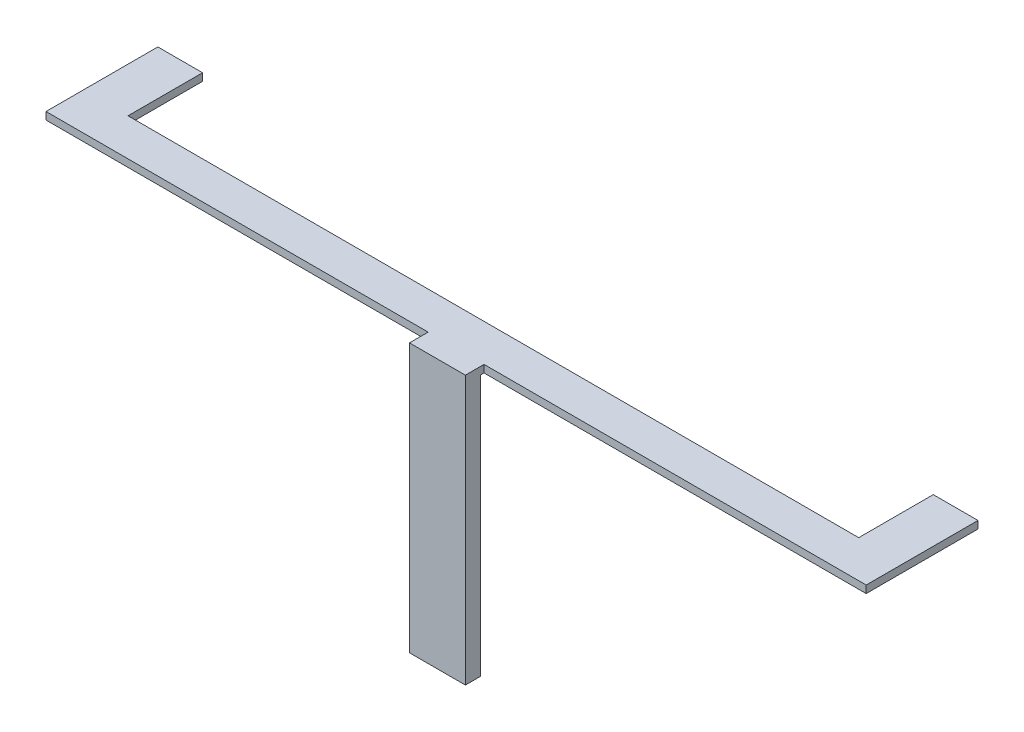
ISO-10303-21;
HEADER;
FILE_DESCRIPTION(('STEP AP214'),'2;1');
FILE_NAME('part.step','',(''),(''),'','','');
FILE_SCHEMA(('AUTOMOTIVE_DESIGN { 1 0 10303 214 1 1 1 1 }'));
ENDSEC;
DATA;
#1=APPLICATION_CONTEXT('core data for automotive mechanical design processes');
#2=APPLICATION_PROTOCOL_DEFINITION('international standard','automotive_design',2000,#1);
#3=PRODUCT_CONTEXT('',#1,'mechanical');
#4=PRODUCT('Part','Part','',(#3));
#5=PRODUCT_RELATED_PRODUCT_CATEGORY('part','',(#4));
#6=PRODUCT_DEFINITION_FORMATION('','',#4);
#7=PRODUCT_DEFINITION_CONTEXT('part definition',#1,'design');
#8=PRODUCT_DEFINITION('design','',#6,#7);
#9=PRODUCT_DEFINITION_SHAPE('','',#8);
#10=(LENGTH_UNIT() NAMED_UNIT(*) SI_UNIT(.MILLI.,.METRE.));
#11=(NAMED_UNIT(*) PLANE_ANGLE_UNIT() SI_UNIT($,.RADIAN.));
#12=(NAMED_UNIT(*) SI_UNIT($,.STERADIAN.) SOLID_ANGLE_UNIT());
#13=UNCERTAINTY_MEASURE_WITH_UNIT(LENGTH_MEASURE(1.E-05),#10,'distance_accuracy_value','');
#14=(GEOMETRIC_REPRESENTATION_CONTEXT(3) GLOBAL_UNCERTAINTY_ASSIGNED_CONTEXT((#13)) GLOBAL_UNIT_ASSIGNED_CONTEXT((#10,
#11,#12)) REPRESENTATION_CONTEXT('',''));
#15=CARTESIAN_POINT('',(0.,0.,0.));
#16=DIRECTION('',(0.,0.,1.));
#17=DIRECTION('',(1.,0.,0.));
#18=AXIS2_PLACEMENT_3D('',#15,#16,#17);
#19=CARTESIAN_POINT('',(0.,0.,0.));
#20=DIRECTION('',(0.,1.,0.));
#21=DIRECTION('',(0.,0.,1.));
#22=AXIS2_PLACEMENT_3D('',#19,#20,#21);
#23=PLANE('',#22);
#24=DIRECTION('',(1.,0.,0.));
#25=VECTOR('',#24,1.);
#26=CARTESIAN_POINT('',(102.5,0.,1.));
#27=LINE('',#26,#25);
#28=CARTESIAN_POINT('',(102.5,0.,1.));
#29=VERTEX_POINT('',#28);
#30=CARTESIAN_POINT('',(117.5,0.,1.));
#31=VERTEX_POINT('',#30);
#32=EDGE_CURVE('E50',#29,#31,#27,.T.);
#33=ORIENTED_EDGE('',*,*,#32,.F.);
#34=DIRECTION('',(0.,0.,1.));
#35=VECTOR('',#34,1.);
#36=CARTESIAN_POINT('',(102.5,0.,0.));
#37=LINE('',#36,#35);
#38=CARTESIAN_POINT('',(102.5,0.,0.));
#39=VERTEX_POINT('',#38);
#40=EDGE_CURVE('E184',#39,#29,#37,.T.);
#41=ORIENTED_EDGE('',*,*,#40,.F.);
#42=DIRECTION('',(1.,0.,0.));
#43=VECTOR('',#42,1.);
#44=CARTESIAN_POINT('',(0.,0.,0.));
#45=LINE('',#44,#43);
#46=CARTESIAN_POINT('',(0.,0.,0.));
#47=VERTEX_POINT('',#46);
#48=EDGE_CURVE('E97',#47,#39,#45,.T.);
#49=ORIENTED_EDGE('',*,*,#48,.F.);
#50=DIRECTION('',(0.,0.,-1.));
#51=VECTOR('',#50,1.);
#52=CARTESIAN_POINT('',(0.,0.,0.));
#53=LINE('',#52,#51);
#54=CARTESIAN_POINT('',(0.,0.,-30.));
#55=VERTEX_POINT('',#54);
#56=EDGE_CURVE('E180',#47,#55,#53,.T.);
#57=ORIENTED_EDGE('',*,*,#56,.T.);
#58=DIRECTION('',(1.,0.,0.));
#59=VECTOR('',#58,1.);
#60=CARTESIAN_POINT('',(0.,0.,-30.));
#61=LINE('',#60,#59);
#62=CARTESIAN_POINT('',(12.,0.,-30.));
#63=VERTEX_POINT('',#62);
#64=EDGE_CURVE('E177',#55,#63,#61,.T.);
#65=ORIENTED_EDGE('',*,*,#64,.T.);
#66=DIRECTION('',(0.,0.,-1.));
#67=VECTOR('',#66,1.);
#68=CARTESIAN_POINT('',(12.,0.,0.));
#69=LINE('',#68,#67);
#70=CARTESIAN_POINT('',(12.,0.,-10.));
#71=VERTEX_POINT('',#70);
#72=EDGE_CURVE('E174',#71,#63,#69,.T.);
#73=ORIENTED_EDGE('',*,*,#72,.F.);
#74=DIRECTION('',(1.,0.,0.));
#75=VECTOR('',#74,1.);
#76=CARTESIAN_POINT('',(0.,0.,-10.));
#77=LINE('',#76,#75);
#78=CARTESIAN_POINT('',(208.,0.,-10.));
#79=VERTEX_POINT('',#78);
#80=EDGE_CURVE('E171',#71,#79,#77,.T.);
#81=ORIENTED_EDGE('',*,*,#80,.T.);
#82=DIRECTION('',(0.,0.,-1.));
#83=VECTOR('',#82,1.);
#84=CARTESIAN_POINT('',(208.,0.,0.));
#85=LINE('',#84,#83);
#86=CARTESIAN_POINT('',(208.,0.,-30.));
#87=VERTEX_POINT('',#86);
#88=EDGE_CURVE('E168',#79,#87,#85,.T.);
#89=ORIENTED_EDGE('',*,*,#88,.T.);
#90=DIRECTION('',(-1.,0.,0.));
#91=VECTOR('',#90,1.);
#92=CARTESIAN_POINT('',(0.,0.,-30.));
#93=LINE('',#92,#91);
#94=CARTESIAN_POINT('',(220.,0.,-30.));
#95=VERTEX_POINT('',#94);
#96=EDGE_CURVE('E165',#95,#87,#93,.T.);
#97=ORIENTED_EDGE('',*,*,#96,.F.);
#98=DIRECTION('',(0.,0.,-1.));
#99=VECTOR('',#98,1.);
#100=CARTESIAN_POINT('',(220.,0.,0.));
#101=LINE('',#100,#99);
#102=CARTESIAN_POINT('',(220.,0.,0.));
#103=VERTEX_POINT('',#102);
#104=EDGE_CURVE('E163',#103,#95,#101,.T.);
#105=ORIENTED_EDGE('',*,*,#104,.F.);
#106=DIRECTION('',(1.,0.,0.));
#107=VECTOR('',#106,1.);
#108=CARTESIAN_POINT('',(0.,0.,0.));
#109=LINE('',#108,#107);
#110=CARTESIAN_POINT('',(117.5,0.,0.));
#111=VERTEX_POINT('',#110);
#112=EDGE_CURVE('E160',#111,#103,#109,.T.);
#113=ORIENTED_EDGE('',*,*,#112,.F.);
#114=DIRECTION('',(0.,0.,1.));
#115=VECTOR('',#114,1.);
#116=CARTESIAN_POINT('',(117.5,0.,0.));
#117=LINE('',#116,#115);
#118=EDGE_CURVE('E158',#111,#31,#117,.T.);
#119=ORIENTED_EDGE('',*,*,#118,.T.);
#120=EDGE_LOOP('',(#33,#41,#49,#57,#65,#73,#81,#89,#97,#105,#113,#119));
#121=FACE_BOUND('',#120,.T.);
#122=ADVANCED_FACE('F35',(#121),#23,.F.);
#123=CARTESIAN_POINT('',(117.5,2.,0.));
#124=DIRECTION('',(1.,0.,0.));
#125=DIRECTION('',(0.,0.,-1.));
#126=AXIS2_PLACEMENT_3D('',#123,#124,#125);
#127=PLANE('',#126);
#128=ORIENTED_EDGE('',*,*,#118,.F.);
#129=DIRECTION('',(0.,-1.,0.));
#130=VECTOR('',#129,1.);
#131=CARTESIAN_POINT('',(117.5,2.,0.));
#132=LINE('',#131,#130);
#133=CARTESIAN_POINT('',(117.5,2.,0.));
#134=VERTEX_POINT('',#133);
#135=EDGE_CURVE('E11',#134,#111,#132,.T.);
#136=ORIENTED_EDGE('',*,*,#135,.F.);
#137=DIRECTION('',(0.,0.,1.));
#138=VECTOR('',#137,1.);
#139=CARTESIAN_POINT('',(117.5,2.,0.));
#140=LINE('',#139,#138);
#141=CARTESIAN_POINT('',(117.5,2.,5.));
#142=VERTEX_POINT('',#141);
#143=EDGE_CURVE('E186',#134,#142,#140,.T.);
#144=ORIENTED_EDGE('',*,*,#143,.T.);
#145=DIRECTION('',(0.,-1.,0.));
#146=VECTOR('',#145,1.);
#147=CARTESIAN_POINT('',(117.5,2.,5.));
#148=LINE('',#147,#146);
#149=CARTESIAN_POINT('',(117.5,-70.,5.));
#150=VERTEX_POINT('',#149);
#151=EDGE_CURVE('E154',#142,#150,#148,.T.);
#152=ORIENTED_EDGE('',*,*,#151,.T.);
#153=DIRECTION('',(0.,0.,1.));
#154=VECTOR('',#153,1.);
#155=CARTESIAN_POINT('',(117.5,-70.,5.));
#156=LINE('',#155,#154);
#157=CARTESIAN_POINT('',(117.5,-70.,1.));
#158=VERTEX_POINT('',#157);
#159=EDGE_CURVE('E454',#158,#150,#156,.T.);
#160=ORIENTED_EDGE('',*,*,#159,.F.);
#161=DIRECTION('',(0.,1.,0.));
#162=VECTOR('',#161,1.);
#163=CARTESIAN_POINT('',(117.5,-70.,1.));
#164=LINE('',#163,#162);
#165=EDGE_CURVE('E251',#158,#31,#164,.T.);
#166=ORIENTED_EDGE('',*,*,#165,.T.);
#167=EDGE_LOOP('',(#128,#136,#144,#152,#160,#166));
#168=FACE_BOUND('',#167,.T.);
#169=ADVANCED_FACE('F37',(#168),#127,.T.);
#170=CARTESIAN_POINT('',(0.,2.,0.));
#171=DIRECTION('',(0.,0.,-1.));
#172=DIRECTION('',(-1.,0.,0.));
#173=AXIS2_PLACEMENT_3D('',#170,#171,#172);
#174=PLANE('',#173);
#175=ORIENTED_EDGE('',*,*,#112,.T.);
#176=DIRECTION('',(0.,-1.,0.));
#177=VECTOR('',#176,1.);
#178=CARTESIAN_POINT('',(220.,2.,0.));
#179=LINE('',#178,#177);
#180=CARTESIAN_POINT('',(220.,2.,0.));
#181=VERTEX_POINT('',#180);
#182=EDGE_CURVE('E43',#181,#103,#179,.T.);
#183=ORIENTED_EDGE('',*,*,#182,.F.);
#184=DIRECTION('',(1.,0.,0.));
#185=VECTOR('',#184,1.);
#186=CARTESIAN_POINT('',(0.,2.,0.));
#187=LINE('',#186,#185);
#188=EDGE_CURVE('E226',#134,#181,#187,.T.);
#189=ORIENTED_EDGE('',*,*,#188,.F.);
#190=ORIENTED_EDGE('',*,*,#135,.T.);
#191=EDGE_LOOP('',(#175,#183,#189,#190));
#192=FACE_BOUND('',#191,.T.);
#193=ADVANCED_FACE('F257',(#192),#174,.F.);
#194=CARTESIAN_POINT('',(220.,2.,0.));
#195=DIRECTION('',(-1.,0.,0.));
#196=DIRECTION('',(0.,0.,1.));
#197=AXIS2_PLACEMENT_3D('',#194,#195,#196);
#198=PLANE('',#197);
#199=ORIENTED_EDGE('',*,*,#104,.T.);
#200=DIRECTION('',(0.,-1.,0.));
#201=VECTOR('',#200,1.);
#202=CARTESIAN_POINT('',(220.,2.,-30.));
#203=LINE('',#202,#201);
#204=CARTESIAN_POINT('',(220.,2.,-30.));
#205=VERTEX_POINT('',#204);
#206=EDGE_CURVE('E201',#205,#95,#203,.T.);
#207=ORIENTED_EDGE('',*,*,#206,.F.);
#208=DIRECTION('',(0.,0.,-1.));
#209=VECTOR('',#208,1.);
#210=CARTESIAN_POINT('',(220.,2.,0.));
#211=LINE('',#210,#209);
#212=EDGE_CURVE('E210',#181,#205,#211,.T.);
#213=ORIENTED_EDGE('',*,*,#212,.F.);
#214=ORIENTED_EDGE('',*,*,#182,.T.);
#215=EDGE_LOOP('',(#199,#207,#213,#214));
#216=FACE_BOUND('',#215,.T.);
#217=ADVANCED_FACE('F208',(#216),#198,.F.);
#218=CARTESIAN_POINT('',(0.,2.,-30.));
#219=DIRECTION('',(0.,0.,1.));
#220=DIRECTION('',(1.,0.,0.));
#221=AXIS2_PLACEMENT_3D('',#218,#219,#220);
#222=PLANE('',#221);
#223=ORIENTED_EDGE('',*,*,#96,.T.);
#224=DIRECTION('',(0.,-1.,0.));
#225=VECTOR('',#224,1.);
#226=CARTESIAN_POINT('',(208.,2.,-30.));
#227=LINE('',#226,#225);
#228=CARTESIAN_POINT('',(208.,2.,-30.));
#229=VERTEX_POINT('',#228);
#230=EDGE_CURVE('E199',#229,#87,#227,.T.);
#231=ORIENTED_EDGE('',*,*,#230,.F.);
#232=DIRECTION('',(-1.,0.,0.));
#233=VECTOR('',#232,1.);
#234=CARTESIAN_POINT('',(0.,2.,-30.));
#235=LINE('',#234,#233);
#236=EDGE_CURVE('E220',#205,#229,#235,.T.);
#237=ORIENTED_EDGE('',*,*,#236,.F.);
#238=ORIENTED_EDGE('',*,*,#206,.T.);
#239=EDGE_LOOP('',(#223,#231,#237,#238));
#240=FACE_BOUND('',#239,.T.);
#241=ADVANCED_FACE('F217',(#240),#222,.F.);
#242=CARTESIAN_POINT('',(208.,2.,0.));
#243=DIRECTION('',(-1.,0.,0.));
#244=DIRECTION('',(0.,0.,1.));
#245=AXIS2_PLACEMENT_3D('',#242,#243,#244);
#246=PLANE('',#245);
#247=ORIENTED_EDGE('',*,*,#88,.F.);
#248=DIRECTION('',(0.,-1.,0.));
#249=VECTOR('',#248,1.);
#250=CARTESIAN_POINT('',(208.,2.,-10.));
#251=LINE('',#250,#249);
#252=CARTESIAN_POINT('',(208.,2.,-10.));
#253=VERTEX_POINT('',#252);
#254=EDGE_CURVE('E197',#253,#79,#251,.T.);
#255=ORIENTED_EDGE('',*,*,#254,.F.);
#256=DIRECTION('',(0.,0.,-1.));
#257=VECTOR('',#256,1.);
#258=CARTESIAN_POINT('',(208.,2.,0.));
#259=LINE('',#258,#257);
#260=EDGE_CURVE('E222',#253,#229,#259,.T.);
#261=ORIENTED_EDGE('',*,*,#260,.T.);
#262=ORIENTED_EDGE('',*,*,#230,.T.);
#263=EDGE_LOOP('',(#247,#255,#261,#262));
#264=FACE_BOUND('',#263,.T.);
#265=ADVANCED_FACE('F292',(#264),#246,.T.);
#266=CARTESIAN_POINT('',(0.,2.,-10.));
#267=DIRECTION('',(0.,0.,-1.));
#268=DIRECTION('',(-1.,0.,0.));
#269=AXIS2_PLACEMENT_3D('',#266,#267,#268);
#270=PLANE('',#269);
#271=ORIENTED_EDGE('',*,*,#80,.F.);
#272=DIRECTION('',(0.,-1.,0.));
#273=VECTOR('',#272,1.);
#274=CARTESIAN_POINT('',(12.,2.,-10.));
#275=LINE('',#274,#273);
#276=CARTESIAN_POINT('',(12.,2.,-10.));
#277=VERTEX_POINT('',#276);
#278=EDGE_CURVE('E195',#277,#71,#275,.T.);
#279=ORIENTED_EDGE('',*,*,#278,.F.);
#280=DIRECTION('',(1.,0.,0.));
#281=VECTOR('',#280,1.);
#282=CARTESIAN_POINT('',(0.,2.,-10.));
#283=LINE('',#282,#281);
#284=EDGE_CURVE('E224',#277,#253,#283,.T.);
#285=ORIENTED_EDGE('',*,*,#284,.T.);
#286=ORIENTED_EDGE('',*,*,#254,.T.);
#287=EDGE_LOOP('',(#271,#279,#285,#286));
#288=FACE_BOUND('',#287,.T.);
#289=ADVANCED_FACE('F288',(#288),#270,.T.);
#290=CARTESIAN_POINT('',(12.,2.,0.));
#291=DIRECTION('',(-1.,0.,0.));
#292=DIRECTION('',(0.,0.,1.));
#293=AXIS2_PLACEMENT_3D('',#290,#291,#292);
#294=PLANE('',#293);
#295=ORIENTED_EDGE('',*,*,#72,.T.);
#296=DIRECTION('',(0.,-1.,0.));
#297=VECTOR('',#296,1.);
#298=CARTESIAN_POINT('',(12.,2.,-30.));
#299=LINE('',#298,#297);
#300=CARTESIAN_POINT('',(12.,2.,-30.));
#301=VERTEX_POINT('',#300);
#302=EDGE_CURVE('E193',#301,#63,#299,.T.);
#303=ORIENTED_EDGE('',*,*,#302,.F.);
#304=DIRECTION('',(0.,0.,-1.));
#305=VECTOR('',#304,1.);
#306=CARTESIAN_POINT('',(12.,2.,0.));
#307=LINE('',#306,#305);
#308=EDGE_CURVE('E232',#277,#301,#307,.T.);
#309=ORIENTED_EDGE('',*,*,#308,.F.);
#310=ORIENTED_EDGE('',*,*,#278,.T.);
#311=EDGE_LOOP('',(#295,#303,#309,#310));
#312=FACE_BOUND('',#311,.T.);
#313=ADVANCED_FACE('F284',(#312),#294,.F.);
#314=CARTESIAN_POINT('',(0.,2.,-30.));
#315=DIRECTION('',(0.,0.,-1.));
#316=DIRECTION('',(-1.,0.,0.));
#317=AXIS2_PLACEMENT_3D('',#314,#315,#316);
#318=PLANE('',#317);
#319=ORIENTED_EDGE('',*,*,#64,.F.);
#320=DIRECTION('',(0.,-1.,0.));
#321=VECTOR('',#320,1.);
#322=CARTESIAN_POINT('',(0.,2.,-30.));
#323=LINE('',#322,#321);
#324=CARTESIAN_POINT('',(0.,2.,-30.));
#325=VERTEX_POINT('',#324);
#326=EDGE_CURVE('E191',#325,#55,#323,.T.);
#327=ORIENTED_EDGE('',*,*,#326,.F.);
#328=DIRECTION('',(1.,0.,0.));
#329=VECTOR('',#328,1.);
#330=CARTESIAN_POINT('',(0.,2.,-30.));
#331=LINE('',#330,#329);
#332=EDGE_CURVE('E234',#325,#301,#331,.T.);
#333=ORIENTED_EDGE('',*,*,#332,.T.);
#334=ORIENTED_EDGE('',*,*,#302,.T.);
#335=EDGE_LOOP('',(#319,#327,#333,#334));
#336=FACE_BOUND('',#335,.T.);
#337=ADVANCED_FACE('F281',(#336),#318,.T.);
#338=CARTESIAN_POINT('',(0.,2.,0.));
#339=DIRECTION('',(-1.,0.,0.));
#340=DIRECTION('',(0.,0.,1.));
#341=AXIS2_PLACEMENT_3D('',#338,#339,#340);
#342=PLANE('',#341);
#343=ORIENTED_EDGE('',*,*,#56,.F.);
#344=DIRECTION('',(0.,-1.,0.));
#345=VECTOR('',#344,1.);
#346=CARTESIAN_POINT('',(0.,2.,0.));
#347=LINE('',#346,#345);
#348=CARTESIAN_POINT('',(0.,2.,0.));
#349=VERTEX_POINT('',#348);
#350=EDGE_CURVE('E147',#349,#47,#347,.T.);
#351=ORIENTED_EDGE('',*,*,#350,.F.);
#352=DIRECTION('',(0.,0.,-1.));
#353=VECTOR('',#352,1.);
#354=CARTESIAN_POINT('',(0.,2.,0.));
#355=LINE('',#354,#353);
#356=EDGE_CURVE('E142',#349,#325,#355,.T.);
#357=ORIENTED_EDGE('',*,*,#356,.T.);
#358=ORIENTED_EDGE('',*,*,#326,.T.);
#359=EDGE_LOOP('',(#343,#351,#357,#358));
#360=FACE_BOUND('',#359,.T.);
#361=ADVANCED_FACE('F238',(#360),#342,.T.);
#362=CARTESIAN_POINT('',(0.,2.,0.));
#363=DIRECTION('',(0.,0.,-1.));
#364=DIRECTION('',(-1.,0.,0.));
#365=AXIS2_PLACEMENT_3D('',#362,#363,#364);
#366=PLANE('',#365);
#367=ORIENTED_EDGE('',*,*,#48,.T.);
#368=DIRECTION('',(0.,-1.,0.));
#369=VECTOR('',#368,1.);
#370=CARTESIAN_POINT('',(102.5,2.,0.));
#371=LINE('',#370,#369);
#372=CARTESIAN_POINT('',(102.5,2.,0.));
#373=VERTEX_POINT('',#372);
#374=EDGE_CURVE('E144',#373,#39,#371,.T.);
#375=ORIENTED_EDGE('',*,*,#374,.F.);
#376=DIRECTION('',(1.,0.,0.));
#377=VECTOR('',#376,1.);
#378=CARTESIAN_POINT('',(0.,2.,0.));
#379=LINE('',#378,#377);
#380=EDGE_CURVE('E135',#349,#373,#379,.T.);
#381=ORIENTED_EDGE('',*,*,#380,.F.);
#382=ORIENTED_EDGE('',*,*,#350,.T.);
#383=EDGE_LOOP('',(#367,#375,#381,#382));
#384=FACE_BOUND('',#383,.T.);
#385=ADVANCED_FACE('F145',(#384),#366,.F.);
#386=CARTESIAN_POINT('',(102.5,2.,0.));
#387=DIRECTION('',(1.,0.,0.));
#388=DIRECTION('',(0.,0.,-1.));
#389=AXIS2_PLACEMENT_3D('',#386,#387,#388);
#390=PLANE('',#389);
#391=ORIENTED_EDGE('',*,*,#40,.T.);
#392=DIRECTION('',(0.,1.,0.));
#393=VECTOR('',#392,1.);
#394=CARTESIAN_POINT('',(102.5,-70.,1.));
#395=LINE('',#394,#393);
#396=CARTESIAN_POINT('',(102.5,-70.,1.));
#397=VERTEX_POINT('',#396);
#398=EDGE_CURVE('E161',#397,#29,#395,.T.);
#399=ORIENTED_EDGE('',*,*,#398,.F.);
#400=DIRECTION('',(0.,0.,-1.));
#401=VECTOR('',#400,1.);
#402=CARTESIAN_POINT('',(102.5,-70.,5.));
#403=LINE('',#402,#401);
#404=CARTESIAN_POINT('',(102.5,-70.,5.));
#405=VERTEX_POINT('',#404);
#406=EDGE_CURVE('E448',#405,#397,#403,.T.);
#407=ORIENTED_EDGE('',*,*,#406,.F.);
#408=DIRECTION('',(0.,-1.,0.));
#409=VECTOR('',#408,1.);
#410=CARTESIAN_POINT('',(102.5,2.,5.));
#411=LINE('',#410,#409);
#412=CARTESIAN_POINT('',(102.5,2.,5.));
#413=VERTEX_POINT('',#412);
#414=EDGE_CURVE('E148',#413,#405,#411,.T.);
#415=ORIENTED_EDGE('',*,*,#414,.F.);
#416=DIRECTION('',(0.,0.,1.));
#417=VECTOR('',#416,1.);
#418=CARTESIAN_POINT('',(102.5,2.,0.));
#419=LINE('',#418,#417);
#420=EDGE_CURVE('E138',#373,#413,#419,.T.);
#421=ORIENTED_EDGE('',*,*,#420,.F.);
#422=ORIENTED_EDGE('',*,*,#374,.T.);
#423=EDGE_LOOP('',(#391,#399,#407,#415,#421,#422));
#424=FACE_BOUND('',#423,.T.);
#425=ADVANCED_FACE('F150',(#424),#390,.F.);
#426=CARTESIAN_POINT('',(0.,2.,5.));
#427=DIRECTION('',(0.,0.,-1.));
#428=DIRECTION('',(-1.,0.,0.));
#429=AXIS2_PLACEMENT_3D('',#426,#427,#428);
#430=PLANE('',#429);
#431=ORIENTED_EDGE('',*,*,#414,.T.);
#432=DIRECTION('',(-1.,0.,0.));
#433=VECTOR('',#432,1.);
#434=CARTESIAN_POINT('',(102.5,-70.,5.));
#435=LINE('',#434,#433);
#436=EDGE_CURVE('E253',#150,#405,#435,.T.);
#437=ORIENTED_EDGE('',*,*,#436,.F.);
#438=ORIENTED_EDGE('',*,*,#151,.F.);
#439=DIRECTION('',(1.,0.,0.));
#440=VECTOR('',#439,1.);
#441=CARTESIAN_POINT('',(0.,2.,5.));
#442=LINE('',#441,#440);
#443=EDGE_CURVE('E59',#413,#142,#442,.T.);
#444=ORIENTED_EDGE('',*,*,#443,.F.);
#445=EDGE_LOOP('',(#431,#437,#438,#444));
#446=FACE_BOUND('',#445,.T.);
#447=ADVANCED_FACE('F271',(#446),#430,.F.);
#448=CARTESIAN_POINT('',(0.,2.,0.));
#449=DIRECTION('',(0.,1.,0.));
#450=DIRECTION('',(0.,0.,1.));
#451=AXIS2_PLACEMENT_3D('',#448,#449,#450);
#452=PLANE('',#451);
#453=ORIENTED_EDGE('',*,*,#143,.F.);
#454=ORIENTED_EDGE('',*,*,#188,.T.);
#455=ORIENTED_EDGE('',*,*,#212,.T.);
#456=ORIENTED_EDGE('',*,*,#236,.T.);
#457=ORIENTED_EDGE('',*,*,#260,.F.);
#458=ORIENTED_EDGE('',*,*,#284,.F.);
#459=ORIENTED_EDGE('',*,*,#308,.T.);
#460=ORIENTED_EDGE('',*,*,#332,.F.);
#461=ORIENTED_EDGE('',*,*,#356,.F.);
#462=ORIENTED_EDGE('',*,*,#380,.T.);
#463=ORIENTED_EDGE('',*,*,#420,.T.);
#464=ORIENTED_EDGE('',*,*,#443,.T.);
#465=EDGE_LOOP('',(#453,#454,#455,#456,#457,#458,#459,#460,#461,#462,#463,#464));
#466=FACE_BOUND('',#465,.T.);
#467=ADVANCED_FACE('F136',(#466),#452,.T.);
#468=CARTESIAN_POINT('',(102.5,-70.,1.));
#469=DIRECTION('',(0.,0.,1.));
#470=DIRECTION('',(1.,0.,0.));
#471=AXIS2_PLACEMENT_3D('',#468,#469,#470);
#472=PLANE('',#471);
#473=ORIENTED_EDGE('',*,*,#32,.T.);
#474=ORIENTED_EDGE('',*,*,#165,.F.);
#475=DIRECTION('',(1.,0.,0.));
#476=VECTOR('',#475,1.);
#477=CARTESIAN_POINT('',(102.5,-70.,1.));
#478=LINE('',#477,#476);
#479=EDGE_CURVE('E249',#397,#158,#478,.T.);
#480=ORIENTED_EDGE('',*,*,#479,.F.);
#481=ORIENTED_EDGE('',*,*,#398,.T.);
#482=EDGE_LOOP('',(#473,#474,#480,#481));
#483=FACE_BOUND('',#482,.T.);
#484=ADVANCED_FACE('F245',(#483),#472,.F.);
#485=CARTESIAN_POINT('',(0.,-70.,0.));
#486=DIRECTION('',(0.,-1.,0.));
#487=DIRECTION('',(0.,0.,-1.));
#488=AXIS2_PLACEMENT_3D('',#485,#486,#487);
#489=PLANE('',#488);
#490=ORIENTED_EDGE('',*,*,#406,.T.);
#491=ORIENTED_EDGE('',*,*,#479,.T.);
#492=ORIENTED_EDGE('',*,*,#159,.T.);
#493=ORIENTED_EDGE('',*,*,#436,.T.);
#494=EDGE_LOOP('',(#490,#491,#492,#493));
#495=FACE_BOUND('',#494,.T.);
#496=ADVANCED_FACE('F346',(#495),#489,.T.);
#497=CLOSED_SHELL('',(#122,#169,#193,#217,#241,#265,#289,#313,#337,#361,#385,#425,#447,#467,
#484,#496));
#498=MANIFOLD_SOLID_BREP('B2',#497);
#499=ADVANCED_BREP_SHAPE_REPRESENTATION('',(#18,#498),#14);
#500=SHAPE_DEFINITION_REPRESENTATION(#9,#499);
ENDSEC;
END-ISO-10303-21;
